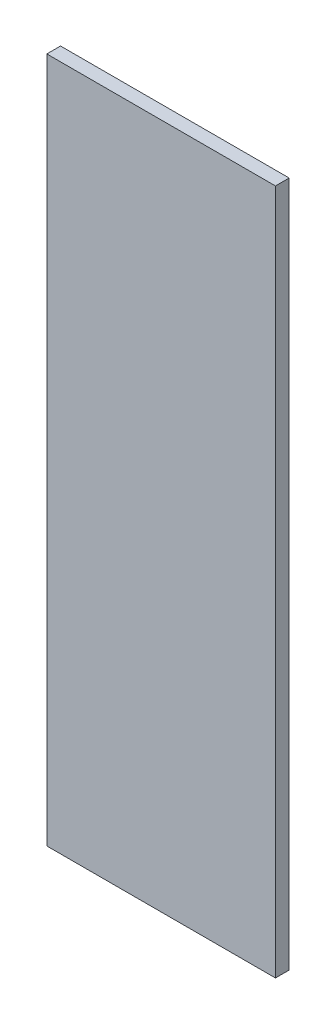
ISO-10303-21;
HEADER;
FILE_DESCRIPTION(('STEP AP214'),'2;1');
FILE_NAME('part.step','',(''),(''),'','','');
FILE_SCHEMA(('AUTOMOTIVE_DESIGN { 1 0 10303 214 1 1 1 1 }'));
ENDSEC;
DATA;
#1=APPLICATION_CONTEXT('core data for automotive mechanical design processes');
#2=APPLICATION_PROTOCOL_DEFINITION('international standard','automotive_design',2000,#1);
#3=PRODUCT_CONTEXT('',#1,'mechanical');
#4=PRODUCT('Part','Part','',(#3));
#5=PRODUCT_RELATED_PRODUCT_CATEGORY('part','',(#4));
#6=PRODUCT_DEFINITION_FORMATION('','',#4);
#7=PRODUCT_DEFINITION_CONTEXT('part definition',#1,'design');
#8=PRODUCT_DEFINITION('design','',#6,#7);
#9=PRODUCT_DEFINITION_SHAPE('','',#8);
#10=(LENGTH_UNIT() NAMED_UNIT(*) SI_UNIT(.MILLI.,.METRE.));
#11=(NAMED_UNIT(*) PLANE_ANGLE_UNIT() SI_UNIT($,.RADIAN.));
#12=(NAMED_UNIT(*) SI_UNIT($,.STERADIAN.) SOLID_ANGLE_UNIT());
#13=UNCERTAINTY_MEASURE_WITH_UNIT(LENGTH_MEASURE(1.E-05),#10,'distance_accuracy_value','');
#14=(GEOMETRIC_REPRESENTATION_CONTEXT(3) GLOBAL_UNCERTAINTY_ASSIGNED_CONTEXT((#13)) GLOBAL_UNIT_ASSIGNED_CONTEXT((#10,
#11,#12)) REPRESENTATION_CONTEXT('',''));
#15=CARTESIAN_POINT('',(0.,0.,0.));
#16=DIRECTION('',(0.,0.,1.));
#17=DIRECTION('',(1.,0.,0.));
#18=AXIS2_PLACEMENT_3D('',#15,#16,#17);
#19=CARTESIAN_POINT('',(-250.,-857.462689126393,30.));
#20=DIRECTION('',(0.,1.,0.));
#21=DIRECTION('',(0.,0.,1.));
#22=AXIS2_PLACEMENT_3D('',#19,#20,#21);
#23=PLANE('',#22);
#24=DIRECTION('',(1.,0.,0.));
#25=VECTOR('',#24,1.);
#26=CARTESIAN_POINT('',(-250.,-857.462689126393,0.));
#27=LINE('',#26,#25);
#28=CARTESIAN_POINT('',(-250.,-857.462689126393,0.));
#29=VERTEX_POINT('',#28);
#30=CARTESIAN_POINT('',(250.,-857.462689126393,0.));
#31=VERTEX_POINT('',#30);
#32=EDGE_CURVE('E113',#29,#31,#27,.T.);
#33=ORIENTED_EDGE('',*,*,#32,.T.);
#34=DIRECTION('',(0.,0.,-1.));
#35=VECTOR('',#34,1.);
#36=CARTESIAN_POINT('',(250.,-857.462689126393,30.));
#37=LINE('',#36,#35);
#38=CARTESIAN_POINT('',(250.,-857.462689126393,30.));
#39=VERTEX_POINT('',#38);
#40=EDGE_CURVE('E11',#39,#31,#37,.T.);
#41=ORIENTED_EDGE('',*,*,#40,.F.);
#42=DIRECTION('',(1.,0.,0.));
#43=VECTOR('',#42,1.);
#44=CARTESIAN_POINT('',(-250.,-857.462689126393,30.));
#45=LINE('',#44,#43);
#46=CARTESIAN_POINT('',(-250.,-857.462689126393,30.));
#47=VERTEX_POINT('',#46);
#48=EDGE_CURVE('E95',#47,#39,#45,.T.);
#49=ORIENTED_EDGE('',*,*,#48,.F.);
#50=DIRECTION('',(0.,0.,-1.));
#51=VECTOR('',#50,1.);
#52=CARTESIAN_POINT('',(-250.,-857.462689126393,30.));
#53=LINE('',#52,#51);
#54=EDGE_CURVE('E62',#47,#29,#53,.T.);
#55=ORIENTED_EDGE('',*,*,#54,.T.);
#56=EDGE_LOOP('',(#33,#41,#49,#55));
#57=FACE_BOUND('',#56,.T.);
#58=ADVANCED_FACE('F45',(#57),#23,.F.);
#59=CARTESIAN_POINT('',(250.,-857.462689126393,30.));
#60=DIRECTION('',(-1.,0.,0.));
#61=DIRECTION('',(0.,0.,1.));
#62=AXIS2_PLACEMENT_3D('',#59,#60,#61);
#63=PLANE('',#62);
#64=DIRECTION('',(0.,1.,0.));
#65=VECTOR('',#64,1.);
#66=CARTESIAN_POINT('',(250.,-857.462689126393,0.));
#67=LINE('',#66,#65);
#68=CARTESIAN_POINT('',(250.,642.537310873607,0.));
#69=VERTEX_POINT('',#68);
#70=EDGE_CURVE('E101',#31,#69,#67,.T.);
#71=ORIENTED_EDGE('',*,*,#70,.T.);
#72=DIRECTION('',(0.,0.,-1.));
#73=VECTOR('',#72,1.);
#74=CARTESIAN_POINT('',(250.,642.537310873607,30.));
#75=LINE('',#74,#73);
#76=CARTESIAN_POINT('',(250.,642.537310873607,30.));
#77=VERTEX_POINT('',#76);
#78=EDGE_CURVE('E54',#77,#69,#75,.T.);
#79=ORIENTED_EDGE('',*,*,#78,.F.);
#80=DIRECTION('',(0.,1.,0.));
#81=VECTOR('',#80,1.);
#82=CARTESIAN_POINT('',(250.,-857.462689126393,30.));
#83=LINE('',#82,#81);
#84=EDGE_CURVE('E87',#39,#77,#83,.T.);
#85=ORIENTED_EDGE('',*,*,#84,.F.);
#86=ORIENTED_EDGE('',*,*,#40,.T.);
#87=EDGE_LOOP('',(#71,#79,#85,#86));
#88=FACE_BOUND('',#87,.T.);
#89=ADVANCED_FACE('F100',(#88),#63,.F.);
#90=CARTESIAN_POINT('',(-250.,642.537310873607,30.));
#91=DIRECTION('',(0.,1.,0.));
#92=DIRECTION('',(0.,0.,1.));
#93=AXIS2_PLACEMENT_3D('',#90,#91,#92);
#94=PLANE('',#93);
#95=DIRECTION('',(1.,0.,0.));
#96=VECTOR('',#95,1.);
#97=CARTESIAN_POINT('',(-250.,642.537310873607,0.));
#98=LINE('',#97,#96);
#99=CARTESIAN_POINT('',(-250.,642.537310873607,0.));
#100=VERTEX_POINT('',#99);
#101=EDGE_CURVE('E118',#100,#69,#98,.T.);
#102=ORIENTED_EDGE('',*,*,#101,.F.);
#103=DIRECTION('',(0.,0.,-1.));
#104=VECTOR('',#103,1.);
#105=CARTESIAN_POINT('',(-250.,642.537310873607,30.));
#106=LINE('',#105,#104);
#107=CARTESIAN_POINT('',(-250.,642.537310873607,30.));
#108=VERTEX_POINT('',#107);
#109=EDGE_CURVE('E76',#108,#100,#106,.T.);
#110=ORIENTED_EDGE('',*,*,#109,.F.);
#111=DIRECTION('',(1.,0.,0.));
#112=VECTOR('',#111,1.);
#113=CARTESIAN_POINT('',(-250.,642.537310873607,30.));
#114=LINE('',#113,#112);
#115=EDGE_CURVE('E94',#108,#77,#114,.T.);
#116=ORIENTED_EDGE('',*,*,#115,.T.);
#117=ORIENTED_EDGE('',*,*,#78,.T.);
#118=EDGE_LOOP('',(#102,#110,#116,#117));
#119=FACE_BOUND('',#118,.T.);
#120=ADVANCED_FACE('F105',(#119),#94,.T.);
#121=CARTESIAN_POINT('',(-250.,-857.462689126393,30.));
#122=DIRECTION('',(-1.,0.,0.));
#123=DIRECTION('',(0.,0.,1.));
#124=AXIS2_PLACEMENT_3D('',#121,#122,#123);
#125=PLANE('',#124);
#126=DIRECTION('',(0.,1.,0.));
#127=VECTOR('',#126,1.);
#128=CARTESIAN_POINT('',(-250.,-857.462689126393,0.));
#129=LINE('',#128,#127);
#130=EDGE_CURVE('E121',#29,#100,#129,.T.);
#131=ORIENTED_EDGE('',*,*,#130,.F.);
#132=ORIENTED_EDGE('',*,*,#54,.F.);
#133=DIRECTION('',(0.,1.,0.));
#134=VECTOR('',#133,1.);
#135=CARTESIAN_POINT('',(-250.,-857.462689126393,30.));
#136=LINE('',#135,#134);
#137=EDGE_CURVE('E107',#47,#108,#136,.T.);
#138=ORIENTED_EDGE('',*,*,#137,.T.);
#139=ORIENTED_EDGE('',*,*,#109,.T.);
#140=EDGE_LOOP('',(#131,#132,#138,#139));
#141=FACE_BOUND('',#140,.T.);
#142=ADVANCED_FACE('F131',(#141),#125,.T.);
#143=CARTESIAN_POINT('',(0.,0.,30.));
#144=DIRECTION('',(0.,0.,1.));
#145=DIRECTION('',(1.,0.,0.));
#146=AXIS2_PLACEMENT_3D('',#143,#144,#145);
#147=PLANE('',#146);
#148=ORIENTED_EDGE('',*,*,#48,.T.);
#149=ORIENTED_EDGE('',*,*,#84,.T.);
#150=ORIENTED_EDGE('',*,*,#115,.F.);
#151=ORIENTED_EDGE('',*,*,#137,.F.);
#152=EDGE_LOOP('',(#148,#149,#150,#151));
#153=FACE_BOUND('',#152,.T.);
#154=ADVANCED_FACE('F91',(#153),#147,.T.);
#155=CARTESIAN_POINT('',(0.,0.,0.));
#156=DIRECTION('',(0.,0.,1.));
#157=DIRECTION('',(1.,0.,0.));
#158=AXIS2_PLACEMENT_3D('',#155,#156,#157);
#159=PLANE('',#158);
#160=ORIENTED_EDGE('',*,*,#32,.F.);
#161=ORIENTED_EDGE('',*,*,#130,.T.);
#162=ORIENTED_EDGE('',*,*,#101,.T.);
#163=ORIENTED_EDGE('',*,*,#70,.F.);
#164=EDGE_LOOP('',(#160,#161,#162,#163));
#165=FACE_BOUND('',#164,.T.);
#166=ADVANCED_FACE('F130',(#165),#159,.F.);
#167=CLOSED_SHELL('',(#58,#89,#120,#142,#154,#166));
#168=MANIFOLD_SOLID_BREP('B2',#167);
#169=ADVANCED_BREP_SHAPE_REPRESENTATION('',(#18,#168),#14);
#170=SHAPE_DEFINITION_REPRESENTATION(#9,#169);
ENDSEC;
END-ISO-10303-21;
